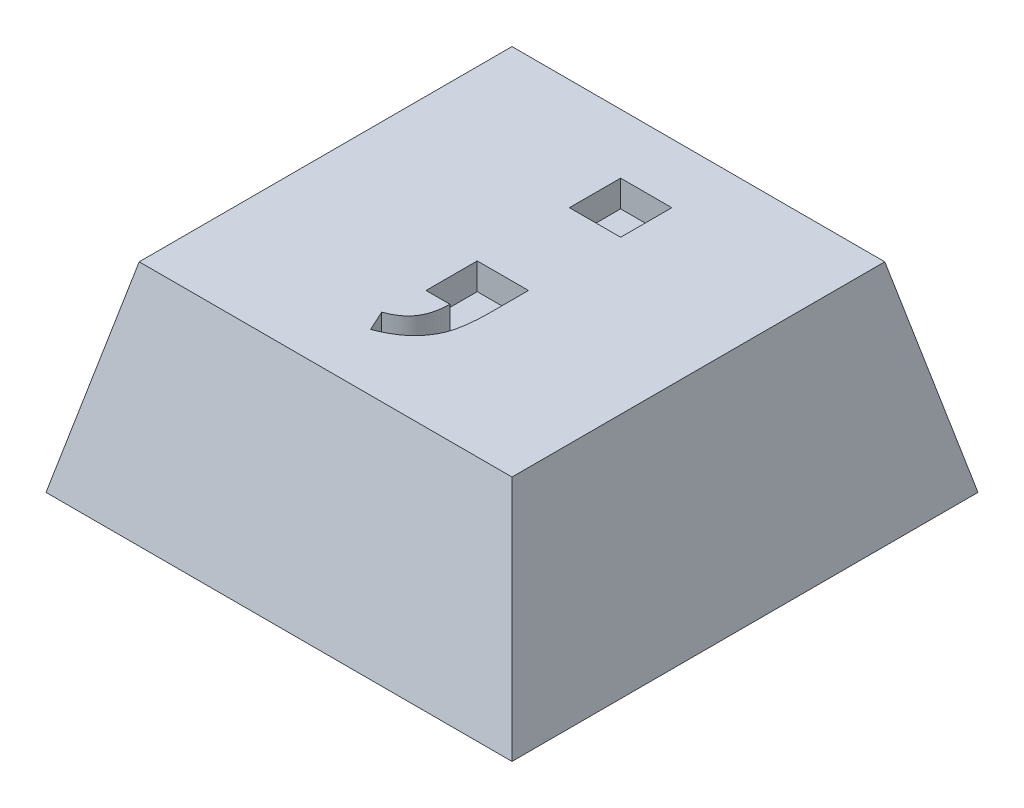
ISO-10303-21;
HEADER;
FILE_DESCRIPTION(('STEP AP214'),'2;1');
FILE_NAME('part.step','',(''),(''),'','','');
FILE_SCHEMA(('AUTOMOTIVE_DESIGN { 1 0 10303 214 1 1 1 1 }'));
ENDSEC;
DATA;
#1=APPLICATION_CONTEXT('core data for automotive mechanical design processes');
#2=APPLICATION_PROTOCOL_DEFINITION('international standard','automotive_design',2000,#1);
#3=PRODUCT_CONTEXT('',#1,'mechanical');
#4=PRODUCT('Part','Part','',(#3));
#5=PRODUCT_RELATED_PRODUCT_CATEGORY('part','',(#4));
#6=PRODUCT_DEFINITION_FORMATION('','',#4);
#7=PRODUCT_DEFINITION_CONTEXT('part definition',#1,'design');
#8=PRODUCT_DEFINITION('design','',#6,#7);
#9=PRODUCT_DEFINITION_SHAPE('','',#8);
#10=(LENGTH_UNIT() NAMED_UNIT(*) SI_UNIT(.MILLI.,.METRE.));
#11=(NAMED_UNIT(*) PLANE_ANGLE_UNIT() SI_UNIT($,.RADIAN.));
#12=(NAMED_UNIT(*) SI_UNIT($,.STERADIAN.) SOLID_ANGLE_UNIT());
#13=UNCERTAINTY_MEASURE_WITH_UNIT(LENGTH_MEASURE(1.E-05),#10,'distance_accuracy_value','');
#14=(GEOMETRIC_REPRESENTATION_CONTEXT(3) GLOBAL_UNCERTAINTY_ASSIGNED_CONTEXT((#13)) GLOBAL_UNIT_ASSIGNED_CONTEXT((#10,
#11,#12)) REPRESENTATION_CONTEXT('',''));
#15=CARTESIAN_POINT('',(0.,0.,0.));
#16=DIRECTION('',(0.,0.,1.));
#17=DIRECTION('',(1.,0.,0.));
#18=AXIS2_PLACEMENT_3D('',#15,#16,#17);
#19=CARTESIAN_POINT('',(0.,3.,0.));
#20=DIRECTION('',(0.,-1.,0.));
#21=DIRECTION('',(0.,0.,-1.));
#22=AXIS2_PLACEMENT_3D('',#19,#20,#21);
#23=PLANE('',#22);
#24=DIRECTION('',(0.,0.,-1.));
#25=VECTOR('',#24,1.);
#26=CARTESIAN_POINT('',(3.22747857803023,3.,-2.48120788792806));
#27=LINE('',#26,#25);
#28=CARTESIAN_POINT('',(3.22747857803023,3.,-2.48120788792806));
#29=VERTEX_POINT('',#28);
#30=CARTESIAN_POINT('',(3.22747857803023,3.,-3.25043865715883));
#31=VERTEX_POINT('',#30);
#32=EDGE_CURVE('E66',#29,#31,#27,.T.);
#33=ORIENTED_EDGE('',*,*,#32,.T.);
#34=DIRECTION('',(1.,0.,0.));
#35=VECTOR('',#34,1.);
#36=CARTESIAN_POINT('',(3.22747857803023,3.,-3.25043865715883));
#37=LINE('',#36,#35);
#38=CARTESIAN_POINT('',(3.996709347261,3.,-3.25043865715883));
#39=VERTEX_POINT('',#38);
#40=EDGE_CURVE('E239',#31,#39,#37,.T.);
#41=ORIENTED_EDGE('',*,*,#40,.T.);
#42=DIRECTION('',(0.,0.,1.));
#43=VECTOR('',#42,1.);
#44=CARTESIAN_POINT('',(3.996709347261,3.,-3.25043865715883));
#45=LINE('',#44,#43);
#46=CARTESIAN_POINT('',(3.996709347261,3.,-2.69114378536396));
#47=VERTEX_POINT('',#46);
#48=EDGE_CURVE('E232',#39,#47,#45,.T.);
#49=ORIENTED_EDGE('',*,*,#48,.T.);
#50=CARTESIAN_POINT('',(3.996709347261,3.,-2.69114378536396));
#51=CARTESIAN_POINT('',(3.99635444936056,3.,-2.63742840426689));
#52=CARTESIAN_POINT('',(3.99568435556763,3.,-2.53600671816361));
#53=CARTESIAN_POINT('',(3.98393837916526,3.,-2.39293749753973));
#54=CARTESIAN_POINT('',(3.96761745240946,3.,-2.267298215301));
#55=CARTESIAN_POINT('',(3.94165328117557,3.,-2.15747392929813));
#56=CARTESIAN_POINT('',(3.90688978373088,3.,-2.05829350239677));
#57=CARTESIAN_POINT('',(3.85773980942026,3.,-1.9675400512293));
#58=CARTESIAN_POINT('',(3.79729474601488,3.,-1.88069217235622));
#59=CARTESIAN_POINT('',(3.72336046891853,3.,-1.80037779275607));
#60=CARTESIAN_POINT('',(3.63830927563528,3.,-1.72609505711932));
#61=CARTESIAN_POINT('',(3.54115563525707,3.,-1.66149819114179));
#62=CARTESIAN_POINT('',(3.4342051517655,3.,-1.60394557264723));
#63=CARTESIAN_POINT('',(3.35736953246386,3.,-1.57364653498224));
#64=CARTESIAN_POINT('',(3.31802344982511,3.,-1.55813096485114));
#65=B_SPLINE_CURVE_WITH_KNOTS('',3,(#50,#51,#52,#53,#54,#55,#56,#57,#58,#59,#60,#61,#62,#63,
#64),.UNSPECIFIED.,.F.,.F.,(4,1,1,1,1,1,1,1,1,1,1,1,4),(0.,0.11226306929848,0.211967401940366,
0.29994169044828,0.376872974033872,0.447529216959618,0.518973247744178,0.591939579442453,
0.668229800220916,0.746606683184937,0.827453118097728,0.911641971053369,1.),.UNSPECIFIED.);
#66=CARTESIAN_POINT('',(3.31802344982511,3.,-1.55813096485114));
#67=VERTEX_POINT('',#66);
#68=EDGE_CURVE('E226',#47,#67,#65,.T.);
#69=ORIENTED_EDGE('',*,*,#68,.T.);
#70=DIRECTION('',(-0.418608195745653,0.,-0.908166933143114));
#71=VECTOR('',#70,1.);
#72=CARTESIAN_POINT('',(3.31802344982511,3.,-1.55813096485114));
#73=LINE('',#72,#71);
#74=CARTESIAN_POINT('',(3.17619652674818,3.,-1.86582327254344));
#75=VERTEX_POINT('',#74);
#76=EDGE_CURVE('E219',#67,#75,#73,.T.);
#77=ORIENTED_EDGE('',*,*,#76,.T.);
#78=CARTESIAN_POINT('',(3.17619652674818,3.,-1.86582327254344));
#79=CARTESIAN_POINT('',(3.2105450456693,3.,-1.87986986350777));
#80=CARTESIAN_POINT('',(3.27621594534879,3.,-1.90672552701325));
#81=CARTESIAN_POINT('',(3.36374476051781,3.,-1.9596058917376));
#82=CARTESIAN_POINT('',(3.43507814452289,3.,-2.02140519194155));
#83=CARTESIAN_POINT('',(3.49161844861408,3.,-2.09210378175971));
#84=CARTESIAN_POINT('',(3.53231925103179,3.,-2.17387994464909));
#85=CARTESIAN_POINT('',(3.56335867780006,3.,-2.26565496614817));
#86=CARTESIAN_POINT('',(3.5809695680978,3.,-2.36972649680248));
#87=CARTESIAN_POINT('',(3.58457126362954,3.,-2.44295192356366));
#88=CARTESIAN_POINT('',(3.58645293700459,3.,-2.48120788792806));
#89=B_SPLINE_CURVE_WITH_KNOTS('',3,(#78,#79,#80,#81,#82,#83,#84,#85,#86,#87,#88),.UNSPECIFIED.,
.F.,.F.,(4,1,1,1,1,1,1,1,4),(0.,0.139427091721974,0.266570520088693,0.382614322525073,
0.49274666985973,0.604615352902253,0.724373630152636,0.856001486790094,1.),.UNSPECIFIED.);
#90=CARTESIAN_POINT('',(3.58645293700459,3.,-2.48120788792806));
#91=VERTEX_POINT('',#90);
#92=EDGE_CURVE('E212',#75,#91,#89,.T.);
#93=ORIENTED_EDGE('',*,*,#92,.T.);
#94=DIRECTION('',(-1.,0.,0.));
#95=VECTOR('',#94,1.);
#96=CARTESIAN_POINT('',(3.58645293700459,3.,-2.48120788792806));
#97=LINE('',#96,#95);
#98=EDGE_CURVE('E208',#91,#29,#97,.T.);
#99=ORIENTED_EDGE('',*,*,#98,.T.);
#100=EDGE_LOOP('',(#33,#41,#49,#69,#77,#93,#99));
#101=FACE_BOUND('',#100,.T.);
#102=DIRECTION('',(-1.,0.,0.));
#103=VECTOR('',#102,1.);
#104=CARTESIAN_POINT('',(11.,3.,-0.7));
#105=LINE('',#104,#103);
#106=CARTESIAN_POINT('',(6.3,3.,-0.7));
#107=VERTEX_POINT('',#106);
#108=CARTESIAN_POINT('',(0.7,3.,-0.7));
#109=VERTEX_POINT('',#108);
#110=EDGE_CURVE('E309',#107,#109,#105,.T.);
#111=ORIENTED_EDGE('',*,*,#110,.F.);
#112=DIRECTION('',(0.,0.,1.));
#113=VECTOR('',#112,1.);
#114=CARTESIAN_POINT('',(6.3,3.,-7.));
#115=LINE('',#114,#113);
#116=CARTESIAN_POINT('',(6.3,3.,-6.3));
#117=VERTEX_POINT('',#116);
#118=EDGE_CURVE('E395',#117,#107,#115,.T.);
#119=ORIENTED_EDGE('',*,*,#118,.F.);
#120=DIRECTION('',(-1.,0.,0.));
#121=VECTOR('',#120,1.);
#122=CARTESIAN_POINT('',(11.,3.,-6.3));
#123=LINE('',#122,#121);
#124=CARTESIAN_POINT('',(0.699999999999998,3.,-6.3));
#125=VERTEX_POINT('',#124);
#126=EDGE_CURVE('E382',#117,#125,#123,.T.);
#127=ORIENTED_EDGE('',*,*,#126,.T.);
#128=DIRECTION('',(0.,0.,1.));
#129=VECTOR('',#128,1.);
#130=CARTESIAN_POINT('',(0.7,3.,-7.));
#131=LINE('',#130,#129);
#132=EDGE_CURVE('E396',#125,#109,#131,.T.);
#133=ORIENTED_EDGE('',*,*,#132,.T.);
#134=EDGE_LOOP('',(#111,#119,#127,#133));
#135=FACE_BOUND('',#134,.T.);
#136=DIRECTION('',(-1.,0.,0.));
#137=VECTOR('',#136,1.);
#138=CARTESIAN_POINT('',(3.996709347261,3.,-4.63505404177421));
#139=LINE('',#138,#137);
#140=CARTESIAN_POINT('',(3.996709347261,3.,-4.63505404177421));
#141=VERTEX_POINT('',#140);
#142=CARTESIAN_POINT('',(3.22747857803023,3.,-4.63505404177421));
#143=VERTEX_POINT('',#142);
#144=EDGE_CURVE('E58',#141,#143,#139,.T.);
#145=ORIENTED_EDGE('',*,*,#144,.T.);
#146=DIRECTION('',(0.,0.,-1.));
#147=VECTOR('',#146,1.);
#148=CARTESIAN_POINT('',(3.22747857803023,3.,-4.63505404177421));
#149=LINE('',#148,#147);
#150=CARTESIAN_POINT('',(3.22747857803023,3.,-5.40428481100498));
#151=VERTEX_POINT('',#150);
#152=EDGE_CURVE('E172',#143,#151,#149,.T.);
#153=ORIENTED_EDGE('',*,*,#152,.T.);
#154=DIRECTION('',(1.,0.,0.));
#155=VECTOR('',#154,1.);
#156=CARTESIAN_POINT('',(3.22747857803023,3.,-5.40428481100498));
#157=LINE('',#156,#155);
#158=CARTESIAN_POINT('',(3.996709347261,3.,-5.40428481100498));
#159=VERTEX_POINT('',#158);
#160=EDGE_CURVE('E317',#151,#159,#157,.T.);
#161=ORIENTED_EDGE('',*,*,#160,.T.);
#162=DIRECTION('',(0.,0.,1.));
#163=VECTOR('',#162,1.);
#164=CARTESIAN_POINT('',(3.996709347261,3.,-5.40428481100498));
#165=LINE('',#164,#163);
#166=EDGE_CURVE('E168',#159,#141,#165,.T.);
#167=ORIENTED_EDGE('',*,*,#166,.T.);
#168=EDGE_LOOP('',(#145,#153,#161,#167));
#169=FACE_BOUND('',#168,.T.);
#170=ADVANCED_FACE('F42',(#101,#135,#169),#23,.F.);
#171=CARTESIAN_POINT('',(7.,0.,-7.));
#172=DIRECTION('',(-0.973841209741793,-0.227229615606418,0.));
#173=DIRECTION('',(0.227229615606418,-0.973841209741793,0.));
#174=AXIS2_PLACEMENT_3D('',#171,#172,#173);
#175=PLANE('',#174);
#176=DIRECTION('',(-0.221581128241521,0.949633406749377,-0.221581128241521));
#177=VECTOR('',#176,1.);
#178=CARTESIAN_POINT('',(6.6563126252505,1.47294589178357,-0.343687374749499));
#179=LINE('',#178,#177);
#180=CARTESIAN_POINT('',(7.,0.,0.));
#181=VERTEX_POINT('',#180);
#182=EDGE_CURVE('E392',#181,#107,#179,.T.);
#183=ORIENTED_EDGE('',*,*,#182,.F.);
#184=DIRECTION('',(0.,0.,-1.));
#185=VECTOR('',#184,1.);
#186=CARTESIAN_POINT('',(7.,0.,0.));
#187=LINE('',#186,#185);
#188=CARTESIAN_POINT('',(7.,0.,-7.));
#189=VERTEX_POINT('',#188);
#190=EDGE_CURVE('E408',#181,#189,#187,.T.);
#191=ORIENTED_EDGE('',*,*,#190,.T.);
#192=DIRECTION('',(0.221581128241521,-0.949633406749377,-0.221581128241521));
#193=VECTOR('',#192,1.);
#194=CARTESIAN_POINT('',(7.,0.,-7.));
#195=LINE('',#194,#193);
#196=EDGE_CURVE('E386',#117,#189,#195,.T.);
#197=ORIENTED_EDGE('',*,*,#196,.F.);
#198=ORIENTED_EDGE('',*,*,#118,.T.);
#199=EDGE_LOOP('',(#183,#191,#197,#198));
#200=FACE_BOUND('',#199,.T.);
#201=ADVANCED_FACE('F294',(#200),#175,.F.);
#202=CARTESIAN_POINT('',(0.,0.,-7.));
#203=DIRECTION('',(0.973841209741793,-0.227229615606418,0.));
#204=DIRECTION('',(0.227229615606418,0.973841209741793,0.));
#205=AXIS2_PLACEMENT_3D('',#202,#203,#204);
#206=PLANE('',#205);
#207=DIRECTION('',(-0.221581128241521,-0.949633406749378,0.221581128241521));
#208=VECTOR('',#207,1.);
#209=CARTESIAN_POINT('',(0.343687374749499,1.47294589178357,-0.3436873747495));
#210=LINE('',#209,#208);
#211=CARTESIAN_POINT('',(0.,0.,0.));
#212=VERTEX_POINT('',#211);
#213=EDGE_CURVE('E11',#109,#212,#210,.T.);
#214=ORIENTED_EDGE('',*,*,#213,.F.);
#215=ORIENTED_EDGE('',*,*,#132,.F.);
#216=DIRECTION('',(0.221581128241521,0.949633406749377,0.221581128241521));
#217=VECTOR('',#216,1.);
#218=CARTESIAN_POINT('',(0.,0.,-7.));
#219=LINE('',#218,#217);
#220=CARTESIAN_POINT('',(0.,0.,-7.));
#221=VERTEX_POINT('',#220);
#222=EDGE_CURVE('E51',#221,#125,#219,.T.);
#223=ORIENTED_EDGE('',*,*,#222,.F.);
#224=DIRECTION('',(0.,0.,1.));
#225=VECTOR('',#224,1.);
#226=CARTESIAN_POINT('',(0.,0.,0.));
#227=LINE('',#226,#225);
#228=EDGE_CURVE('E399',#221,#212,#227,.T.);
#229=ORIENTED_EDGE('',*,*,#228,.T.);
#230=EDGE_LOOP('',(#214,#215,#223,#229));
#231=FACE_BOUND('',#230,.T.);
#232=ADVANCED_FACE('F291',(#231),#206,.F.);
#233=CARTESIAN_POINT('',(0.,0.,0.));
#234=DIRECTION('',(0.,-1.,0.));
#235=DIRECTION('',(0.,0.,-1.));
#236=AXIS2_PLACEMENT_3D('',#233,#234,#235);
#237=PLANE('',#236);
#238=CARTESIAN_POINT('',(3.5,0.,-3.5));
#239=DIRECTION('',(0.,-1.,0.));
#240=DIRECTION('',(0.,0.,-1.));
#241=AXIS2_PLACEMENT_3D('',#238,#239,#240);
#242=CIRCLE('',#241,1.8);
#243=CARTESIAN_POINT('',(3.5,0.,-5.3));
#244=VERTEX_POINT('',#243);
#245=EDGE_CURVE('E174',#244,#244,#242,.T.);
#246=ORIENTED_EDGE('',*,*,#245,.F.);
#247=EDGE_LOOP('',(#246));
#248=FACE_BOUND('',#247,.T.);
#249=ORIENTED_EDGE('',*,*,#228,.F.);
#250=DIRECTION('',(-1.,0.,0.));
#251=VECTOR('',#250,1.);
#252=CARTESIAN_POINT('',(0.,0.,-7.));
#253=LINE('',#252,#251);
#254=EDGE_CURVE('E412',#189,#221,#253,.T.);
#255=ORIENTED_EDGE('',*,*,#254,.F.);
#256=ORIENTED_EDGE('',*,*,#190,.F.);
#257=DIRECTION('',(1.,0.,0.));
#258=VECTOR('',#257,1.);
#259=CARTESIAN_POINT('',(0.,0.,0.));
#260=LINE('',#259,#258);
#261=EDGE_CURVE('E405',#212,#181,#260,.T.);
#262=ORIENTED_EDGE('',*,*,#261,.F.);
#263=EDGE_LOOP('',(#249,#255,#256,#262));
#264=FACE_BOUND('',#263,.T.);
#265=ADVANCED_FACE('F44',(#248,#264),#237,.T.);
#266=CARTESIAN_POINT('',(11.,3.,-6.3));
#267=DIRECTION('',(0.,0.227229615606418,-0.973841209741793));
#268=DIRECTION('',(0.,0.973841209741793,0.227229615606418));
#269=AXIS2_PLACEMENT_3D('',#266,#267,#268);
#270=PLANE('',#269);
#271=ORIENTED_EDGE('',*,*,#196,.T.);
#272=ORIENTED_EDGE('',*,*,#254,.T.);
#273=ORIENTED_EDGE('',*,*,#222,.T.);
#274=ORIENTED_EDGE('',*,*,#126,.F.);
#275=EDGE_LOOP('',(#271,#272,#273,#274));
#276=FACE_BOUND('',#275,.T.);
#277=ADVANCED_FACE('F286',(#276),#270,.T.);
#278=CARTESIAN_POINT('',(11.,0.,0.));
#279=DIRECTION('',(0.,0.227229615606418,0.973841209741793));
#280=DIRECTION('',(0.,-0.973841209741793,0.227229615606418));
#281=AXIS2_PLACEMENT_3D('',#278,#279,#280);
#282=PLANE('',#281);
#283=ORIENTED_EDGE('',*,*,#182,.T.);
#284=ORIENTED_EDGE('',*,*,#110,.T.);
#285=ORIENTED_EDGE('',*,*,#213,.T.);
#286=ORIENTED_EDGE('',*,*,#261,.T.);
#287=EDGE_LOOP('',(#283,#284,#285,#286));
#288=FACE_BOUND('',#287,.T.);
#289=ADVANCED_FACE('F282',(#288),#282,.T.);
#290=CARTESIAN_POINT('',(3.5,0.8,-3.5));
#291=DIRECTION('',(0.,-1.,0.));
#292=DIRECTION('',(0.,0.,-1.));
#293=AXIS2_PLACEMENT_3D('',#290,#291,#292);
#294=CYLINDRICAL_SURFACE('',#293,1.8);
#295=CARTESIAN_POINT('',(3.5,0.8,-3.5));
#296=DIRECTION('',(0.,-1.,0.));
#297=DIRECTION('',(0.,0.,-1.));
#298=AXIS2_PLACEMENT_3D('',#295,#296,#297);
#299=CIRCLE('',#298,1.8);
#300=CARTESIAN_POINT('',(3.5,0.8,-5.3));
#301=VERTEX_POINT('',#300);
#302=EDGE_CURVE('E180',#301,#301,#299,.T.);
#303=ORIENTED_EDGE('',*,*,#302,.F.);
#304=EDGE_LOOP('',(#303));
#305=FACE_BOUND('',#304,.T.);
#306=ORIENTED_EDGE('',*,*,#245,.T.);
#307=EDGE_LOOP('',(#306));
#308=FACE_BOUND('',#307,.T.);
#309=ADVANCED_FACE('F278',(#305,#308),#294,.F.);
#310=CARTESIAN_POINT('',(3.5,0.8,-3.5));
#311=DIRECTION('',(0.,-1.,0.));
#312=DIRECTION('',(0.,0.,-1.));
#313=AXIS2_PLACEMENT_3D('',#310,#311,#312);
#314=PLANE('',#313);
#315=ORIENTED_EDGE('',*,*,#302,.T.);
#316=EDGE_LOOP('',(#315));
#317=FACE_BOUND('',#316,.T.);
#318=ADVANCED_FACE('F274',(#317),#314,.T.);
#319=CARTESIAN_POINT('',(3.22747857803023,2.6,-2.48120788792806));
#320=DIRECTION('',(1.,0.,0.));
#321=DIRECTION('',(0.,0.,-1.));
#322=AXIS2_PLACEMENT_3D('',#319,#320,#321);
#323=PLANE('',#322);
#324=ORIENTED_EDGE('',*,*,#32,.F.);
#325=DIRECTION('',(0.,1.,0.));
#326=VECTOR('',#325,1.);
#327=CARTESIAN_POINT('',(3.22747857803023,2.6,-2.48120788792806));
#328=LINE('',#327,#326);
#329=CARTESIAN_POINT('',(3.22747857803023,2.6,-2.48120788792806));
#330=VERTEX_POINT('',#329);
#331=EDGE_CURVE('E204',#330,#29,#328,.T.);
#332=ORIENTED_EDGE('',*,*,#331,.F.);
#333=DIRECTION('',(0.,0.,-1.));
#334=VECTOR('',#333,1.);
#335=CARTESIAN_POINT('',(3.22747857803023,2.6,-2.48120788792806));
#336=LINE('',#335,#334);
#337=CARTESIAN_POINT('',(3.22747857803023,2.6,-3.25043865715883));
#338=VERTEX_POINT('',#337);
#339=EDGE_CURVE('E213',#330,#338,#336,.T.);
#340=ORIENTED_EDGE('',*,*,#339,.T.);
#341=DIRECTION('',(0.,1.,0.));
#342=VECTOR('',#341,1.);
#343=CARTESIAN_POINT('',(3.22747857803023,2.6,-3.25043865715883));
#344=LINE('',#343,#342);
#345=EDGE_CURVE('E186',#338,#31,#344,.T.);
#346=ORIENTED_EDGE('',*,*,#345,.T.);
#347=EDGE_LOOP('',(#324,#332,#340,#346));
#348=FACE_BOUND('',#347,.T.);
#349=ADVANCED_FACE('F277',(#348),#323,.T.);
#350=CARTESIAN_POINT('',(3.22747857803023,2.6,-3.25043865715883));
#351=DIRECTION('',(0.,0.,1.));
#352=DIRECTION('',(1.,0.,0.));
#353=AXIS2_PLACEMENT_3D('',#350,#351,#352);
#354=PLANE('',#353);
#355=ORIENTED_EDGE('',*,*,#40,.F.);
#356=ORIENTED_EDGE('',*,*,#345,.F.);
#357=DIRECTION('',(1.,0.,0.));
#358=VECTOR('',#357,1.);
#359=CARTESIAN_POINT('',(3.22747857803023,2.6,-3.25043865715883));
#360=LINE('',#359,#358);
#361=CARTESIAN_POINT('',(3.996709347261,2.6,-3.25043865715883));
#362=VERTEX_POINT('',#361);
#363=EDGE_CURVE('E374',#338,#362,#360,.T.);
#364=ORIENTED_EDGE('',*,*,#363,.T.);
#365=DIRECTION('',(0.,1.,0.));
#366=VECTOR('',#365,1.);
#367=CARTESIAN_POINT('',(3.996709347261,2.6,-3.25043865715883));
#368=LINE('',#367,#366);
#369=EDGE_CURVE('E189',#362,#39,#368,.T.);
#370=ORIENTED_EDGE('',*,*,#369,.T.);
#371=EDGE_LOOP('',(#355,#356,#364,#370));
#372=FACE_BOUND('',#371,.T.);
#373=ADVANCED_FACE('F352',(#372),#354,.T.);
#374=CARTESIAN_POINT('',(3.996709347261,2.6,-3.25043865715883));
#375=DIRECTION('',(-1.,0.,0.));
#376=DIRECTION('',(0.,0.,1.));
#377=AXIS2_PLACEMENT_3D('',#374,#375,#376);
#378=PLANE('',#377);
#379=ORIENTED_EDGE('',*,*,#48,.F.);
#380=ORIENTED_EDGE('',*,*,#369,.F.);
#381=DIRECTION('',(0.,0.,1.));
#382=VECTOR('',#381,1.);
#383=CARTESIAN_POINT('',(3.996709347261,2.6,-3.25043865715883));
#384=LINE('',#383,#382);
#385=CARTESIAN_POINT('',(3.996709347261,2.6,-2.69114378536396));
#386=VERTEX_POINT('',#385);
#387=EDGE_CURVE('E368',#362,#386,#384,.T.);
#388=ORIENTED_EDGE('',*,*,#387,.T.);
#389=DIRECTION('',(0.,1.,0.));
#390=VECTOR('',#389,1.);
#391=CARTESIAN_POINT('',(3.996709347261,2.6,-2.69114378536396));
#392=LINE('',#391,#390);
#393=EDGE_CURVE('E192',#386,#47,#392,.T.);
#394=ORIENTED_EDGE('',*,*,#393,.T.);
#395=EDGE_LOOP('',(#379,#380,#388,#394));
#396=FACE_BOUND('',#395,.T.);
#397=ADVANCED_FACE('F355',(#396),#378,.T.);
#398=CARTESIAN_POINT('',(3.996709347261,2.6,-2.69114378536396));
#399=CARTESIAN_POINT('',(3.99635444936056,2.6,-2.63742840426689));
#400=CARTESIAN_POINT('',(3.99568435556763,2.6,-2.53600671816361));
#401=CARTESIAN_POINT('',(3.98393837916526,2.6,-2.39293749753973));
#402=CARTESIAN_POINT('',(3.96761745240946,2.6,-2.267298215301));
#403=CARTESIAN_POINT('',(3.94165328117557,2.6,-2.15747392929813));
#404=CARTESIAN_POINT('',(3.90688978373088,2.6,-2.05829350239677));
#405=CARTESIAN_POINT('',(3.85773980942026,2.6,-1.9675400512293));
#406=CARTESIAN_POINT('',(3.79729474601488,2.6,-1.88069217235622));
#407=CARTESIAN_POINT('',(3.72336046891853,2.6,-1.80037779275607));
#408=CARTESIAN_POINT('',(3.63830927563528,2.6,-1.72609505711932));
#409=CARTESIAN_POINT('',(3.54115563525707,2.6,-1.66149819114179));
#410=CARTESIAN_POINT('',(3.4342051517655,2.6,-1.60394557264723));
#411=CARTESIAN_POINT('',(3.35736953246386,2.6,-1.57364653498224));
#412=CARTESIAN_POINT('',(3.31802344982511,2.6,-1.55813096485114));
#413=B_SPLINE_CURVE_WITH_KNOTS('',3,(#398,#399,#400,#401,#402,#403,#404,#405,#406,#407,#408,
#409,#410,#411,#412),.UNSPECIFIED.,.F.,.F.,(4,1,1,1,1,1,1,1,1,1,1,1,4),(0.,0.11226306929848,
0.211967401940366,0.29994169044828,0.376872974033872,0.447529216959618,0.518973247744178,
0.591939579442453,0.668229800220916,0.746606683184937,0.827453118097728,0.911641971053369,1.),.UNSPECIFIED.);
#414=DIRECTION('',(0.,1.,0.));
#415=VECTOR('',#414,1.);
#416=SURFACE_OF_LINEAR_EXTRUSION('',#413,#415);
#417=ORIENTED_EDGE('',*,*,#68,.F.);
#418=ORIENTED_EDGE('',*,*,#393,.F.);
#419=CARTESIAN_POINT('',(3.31802344982511,2.6,-1.55813096485114));
#420=VERTEX_POINT('',#419);
#421=EDGE_CURVE('E362',#386,#420,#413,.T.);
#422=ORIENTED_EDGE('',*,*,#421,.T.);
#423=DIRECTION('',(0.,1.,0.));
#424=VECTOR('',#423,1.);
#425=CARTESIAN_POINT('',(3.31802344982511,2.6,-1.55813096485114));
#426=LINE('',#425,#424);
#427=EDGE_CURVE('E195',#420,#67,#426,.T.);
#428=ORIENTED_EDGE('',*,*,#427,.T.);
#429=EDGE_LOOP('',(#417,#418,#422,#428));
#430=FACE_BOUND('',#429,.T.);
#431=ADVANCED_FACE('F358',(#430),#416,.T.);
#432=CARTESIAN_POINT('',(3.31802344982511,2.6,-1.55813096485114));
#433=DIRECTION('',(0.908166933143114,0.,-0.418608195745653));
#434=DIRECTION('',(-0.418608195745653,0.,-0.908166933143114));
#435=AXIS2_PLACEMENT_3D('',#432,#433,#434);
#436=PLANE('',#435);
#437=ORIENTED_EDGE('',*,*,#76,.F.);
#438=ORIENTED_EDGE('',*,*,#427,.F.);
#439=DIRECTION('',(-0.418608195745653,0.,-0.908166933143114));
#440=VECTOR('',#439,1.);
#441=CARTESIAN_POINT('',(3.31802344982511,2.6,-1.55813096485114));
#442=LINE('',#441,#440);
#443=CARTESIAN_POINT('',(3.17619652674818,2.6,-1.86582327254344));
#444=VERTEX_POINT('',#443);
#445=EDGE_CURVE('E253',#420,#444,#442,.T.);
#446=ORIENTED_EDGE('',*,*,#445,.T.);
#447=DIRECTION('',(0.,1.,0.));
#448=VECTOR('',#447,1.);
#449=CARTESIAN_POINT('',(3.17619652674818,2.6,-1.86582327254344));
#450=LINE('',#449,#448);
#451=EDGE_CURVE('E198',#444,#75,#450,.T.);
#452=ORIENTED_EDGE('',*,*,#451,.T.);
#453=EDGE_LOOP('',(#437,#438,#446,#452));
#454=FACE_BOUND('',#453,.T.);
#455=ADVANCED_FACE('F264',(#454),#436,.T.);
#456=CARTESIAN_POINT('',(3.17619652674818,2.6,-1.86582327254344));
#457=CARTESIAN_POINT('',(3.2105450456693,2.6,-1.87986986350777));
#458=CARTESIAN_POINT('',(3.27621594534879,2.6,-1.90672552701325));
#459=CARTESIAN_POINT('',(3.36374476051781,2.6,-1.9596058917376));
#460=CARTESIAN_POINT('',(3.43507814452289,2.6,-2.02140519194155));
#461=CARTESIAN_POINT('',(3.49161844861408,2.6,-2.09210378175971));
#462=CARTESIAN_POINT('',(3.53231925103179,2.6,-2.17387994464909));
#463=CARTESIAN_POINT('',(3.56335867780006,2.6,-2.26565496614817));
#464=CARTESIAN_POINT('',(3.5809695680978,2.6,-2.36972649680248));
#465=CARTESIAN_POINT('',(3.58457126362954,2.6,-2.44295192356366));
#466=CARTESIAN_POINT('',(3.58645293700459,2.6,-2.48120788792806));
#467=B_SPLINE_CURVE_WITH_KNOTS('',3,(#456,#457,#458,#459,#460,#461,#462,#463,#464,#465,#466),
.UNSPECIFIED.,.F.,.F.,(4,1,1,1,1,1,1,1,4),(0.,0.139427091721974,0.266570520088693,
0.382614322525073,0.49274666985973,0.604615352902253,0.724373630152636,0.856001486790094,1.),.UNSPECIFIED.);
#468=DIRECTION('',(0.,1.,0.));
#469=VECTOR('',#468,1.);
#470=SURFACE_OF_LINEAR_EXTRUSION('',#467,#469);
#471=ORIENTED_EDGE('',*,*,#92,.F.);
#472=ORIENTED_EDGE('',*,*,#451,.F.);
#473=CARTESIAN_POINT('',(3.58645293700459,2.6,-2.48120788792806));
#474=VERTEX_POINT('',#473);
#475=EDGE_CURVE('E247',#444,#474,#467,.T.);
#476=ORIENTED_EDGE('',*,*,#475,.T.);
#477=DIRECTION('',(0.,1.,0.));
#478=VECTOR('',#477,1.);
#479=CARTESIAN_POINT('',(3.58645293700459,2.6,-2.48120788792806));
#480=LINE('',#479,#478);
#481=EDGE_CURVE('E201',#474,#91,#480,.T.);
#482=ORIENTED_EDGE('',*,*,#481,.T.);
#483=EDGE_LOOP('',(#471,#472,#476,#482));
#484=FACE_BOUND('',#483,.T.);
#485=ADVANCED_FACE('F259',(#484),#470,.T.);
#486=CARTESIAN_POINT('',(3.58645293700459,2.6,-2.48120788792806));
#487=DIRECTION('',(0.,0.,-1.));
#488=DIRECTION('',(-1.,0.,0.));
#489=AXIS2_PLACEMENT_3D('',#486,#487,#488);
#490=PLANE('',#489);
#491=ORIENTED_EDGE('',*,*,#98,.F.);
#492=ORIENTED_EDGE('',*,*,#481,.F.);
#493=DIRECTION('',(-1.,0.,0.));
#494=VECTOR('',#493,1.);
#495=CARTESIAN_POINT('',(3.58645293700459,2.6,-2.48120788792806));
#496=LINE('',#495,#494);
#497=EDGE_CURVE('E207',#474,#330,#496,.T.);
#498=ORIENTED_EDGE('',*,*,#497,.T.);
#499=ORIENTED_EDGE('',*,*,#331,.T.);
#500=EDGE_LOOP('',(#491,#492,#498,#499));
#501=FACE_BOUND('',#500,.T.);
#502=ADVANCED_FACE('F263',(#501),#490,.T.);
#503=CARTESIAN_POINT('',(3.87041390627744,2.6,-1.99262068605667));
#504=DIRECTION('',(0.,1.,0.));
#505=DIRECTION('',(0.,0.,1.));
#506=AXIS2_PLACEMENT_3D('',#503,#504,#505);
#507=PLANE('',#506);
#508=ORIENTED_EDGE('',*,*,#339,.F.);
#509=ORIENTED_EDGE('',*,*,#497,.F.);
#510=ORIENTED_EDGE('',*,*,#475,.F.);
#511=ORIENTED_EDGE('',*,*,#445,.F.);
#512=ORIENTED_EDGE('',*,*,#421,.F.);
#513=ORIENTED_EDGE('',*,*,#387,.F.);
#514=ORIENTED_EDGE('',*,*,#363,.F.);
#515=EDGE_LOOP('',(#508,#509,#510,#511,#512,#513,#514));
#516=FACE_BOUND('',#515,.T.);
#517=ADVANCED_FACE('F269',(#516),#507,.T.);
#518=CARTESIAN_POINT('',(3.996709347261,2.6,-4.63505404177421));
#519=DIRECTION('',(0.,0.,-1.));
#520=DIRECTION('',(-1.,0.,0.));
#521=AXIS2_PLACEMENT_3D('',#518,#519,#520);
#522=PLANE('',#521);
#523=ORIENTED_EDGE('',*,*,#144,.F.);
#524=DIRECTION('',(0.,1.,0.));
#525=VECTOR('',#524,1.);
#526=CARTESIAN_POINT('',(3.996709347261,2.6,-4.63505404177421));
#527=LINE('',#526,#525);
#528=CARTESIAN_POINT('',(3.996709347261,2.6,-4.63505404177421));
#529=VERTEX_POINT('',#528);
#530=EDGE_CURVE('E166',#529,#141,#527,.T.);
#531=ORIENTED_EDGE('',*,*,#530,.F.);
#532=DIRECTION('',(-1.,0.,0.));
#533=VECTOR('',#532,1.);
#534=CARTESIAN_POINT('',(3.996709347261,2.6,-4.63505404177421));
#535=LINE('',#534,#533);
#536=CARTESIAN_POINT('',(3.22747857803023,2.6,-4.63505404177421));
#537=VERTEX_POINT('',#536);
#538=EDGE_CURVE('E157',#529,#537,#535,.T.);
#539=ORIENTED_EDGE('',*,*,#538,.T.);
#540=DIRECTION('',(0.,1.,0.));
#541=VECTOR('',#540,1.);
#542=CARTESIAN_POINT('',(3.22747857803023,2.6,-4.63505404177421));
#543=LINE('',#542,#541);
#544=EDGE_CURVE('E165',#537,#143,#543,.T.);
#545=ORIENTED_EDGE('',*,*,#544,.T.);
#546=EDGE_LOOP('',(#523,#531,#539,#545));
#547=FACE_BOUND('',#546,.T.);
#548=ADVANCED_FACE('F164',(#547),#522,.T.);
#549=CARTESIAN_POINT('',(3.22747857803023,2.6,-4.63505404177421));
#550=DIRECTION('',(1.,0.,0.));
#551=DIRECTION('',(0.,0.,-1.));
#552=AXIS2_PLACEMENT_3D('',#549,#550,#551);
#553=PLANE('',#552);
#554=ORIENTED_EDGE('',*,*,#152,.F.);
#555=ORIENTED_EDGE('',*,*,#544,.F.);
#556=DIRECTION('',(0.,0.,-1.));
#557=VECTOR('',#556,1.);
#558=CARTESIAN_POINT('',(3.22747857803023,2.6,-4.63505404177421));
#559=LINE('',#558,#557);
#560=CARTESIAN_POINT('',(3.22747857803023,2.6,-5.40428481100498));
#561=VERTEX_POINT('',#560);
#562=EDGE_CURVE('E153',#537,#561,#559,.T.);
#563=ORIENTED_EDGE('',*,*,#562,.T.);
#564=DIRECTION('',(0.,1.,0.));
#565=VECTOR('',#564,1.);
#566=CARTESIAN_POINT('',(3.22747857803023,2.6,-5.40428481100498));
#567=LINE('',#566,#565);
#568=EDGE_CURVE('E175',#561,#151,#567,.T.);
#569=ORIENTED_EDGE('',*,*,#568,.T.);
#570=EDGE_LOOP('',(#554,#555,#563,#569));
#571=FACE_BOUND('',#570,.T.);
#572=ADVANCED_FACE('F170',(#571),#553,.T.);
#573=CARTESIAN_POINT('',(3.22747857803023,2.6,-5.40428481100498));
#574=DIRECTION('',(0.,0.,1.));
#575=DIRECTION('',(1.,0.,0.));
#576=AXIS2_PLACEMENT_3D('',#573,#574,#575);
#577=PLANE('',#576);
#578=ORIENTED_EDGE('',*,*,#160,.F.);
#579=ORIENTED_EDGE('',*,*,#568,.F.);
#580=DIRECTION('',(1.,0.,0.));
#581=VECTOR('',#580,1.);
#582=CARTESIAN_POINT('',(3.22747857803023,2.6,-5.40428481100498));
#583=LINE('',#582,#581);
#584=CARTESIAN_POINT('',(3.996709347261,2.6,-5.40428481100498));
#585=VERTEX_POINT('',#584);
#586=EDGE_CURVE('E158',#561,#585,#583,.T.);
#587=ORIENTED_EDGE('',*,*,#586,.T.);
#588=DIRECTION('',(0.,1.,0.));
#589=VECTOR('',#588,1.);
#590=CARTESIAN_POINT('',(3.996709347261,2.6,-5.40428481100498));
#591=LINE('',#590,#589);
#592=EDGE_CURVE('E182',#585,#159,#591,.T.);
#593=ORIENTED_EDGE('',*,*,#592,.T.);
#594=EDGE_LOOP('',(#578,#579,#587,#593));
#595=FACE_BOUND('',#594,.T.);
#596=ADVANCED_FACE('F332',(#595),#577,.T.);
#597=CARTESIAN_POINT('',(3.996709347261,2.6,-5.40428481100498));
#598=DIRECTION('',(-1.,0.,0.));
#599=DIRECTION('',(0.,0.,1.));
#600=AXIS2_PLACEMENT_3D('',#597,#598,#599);
#601=PLANE('',#600);
#602=ORIENTED_EDGE('',*,*,#166,.F.);
#603=ORIENTED_EDGE('',*,*,#592,.F.);
#604=DIRECTION('',(0.,0.,1.));
#605=VECTOR('',#604,1.);
#606=CARTESIAN_POINT('',(3.996709347261,2.6,-5.40428481100498));
#607=LINE('',#606,#605);
#608=EDGE_CURVE('E320',#585,#529,#607,.T.);
#609=ORIENTED_EDGE('',*,*,#608,.T.);
#610=ORIENTED_EDGE('',*,*,#530,.T.);
#611=EDGE_LOOP('',(#602,#603,#609,#610));
#612=FACE_BOUND('',#611,.T.);
#613=ADVANCED_FACE('F334',(#612),#601,.T.);
#614=CARTESIAN_POINT('',(0.,2.6,0.));
#615=DIRECTION('',(0.,-1.,0.));
#616=DIRECTION('',(0.,0.,-1.));
#617=AXIS2_PLACEMENT_3D('',#614,#615,#616);
#618=PLANE('',#617);
#619=ORIENTED_EDGE('',*,*,#538,.F.);
#620=ORIENTED_EDGE('',*,*,#608,.F.);
#621=ORIENTED_EDGE('',*,*,#586,.F.);
#622=ORIENTED_EDGE('',*,*,#562,.F.);
#623=EDGE_LOOP('',(#619,#620,#621,#622));
#624=FACE_BOUND('',#623,.T.);
#625=ADVANCED_FACE('F155',(#624),#618,.F.);
#626=CLOSED_SHELL('',(#170,#201,#232,#265,#277,#289,#309,#318,#349,#373,#397,#431,#455,#485,
#502,#517,#548,#572,#596,#613,#625));
#627=MANIFOLD_SOLID_BREP('B2',#626);
#628=ADVANCED_BREP_SHAPE_REPRESENTATION('',(#18,#627),#14);
#629=SHAPE_DEFINITION_REPRESENTATION(#9,#628);
ENDSEC;
END-ISO-10303-21;
